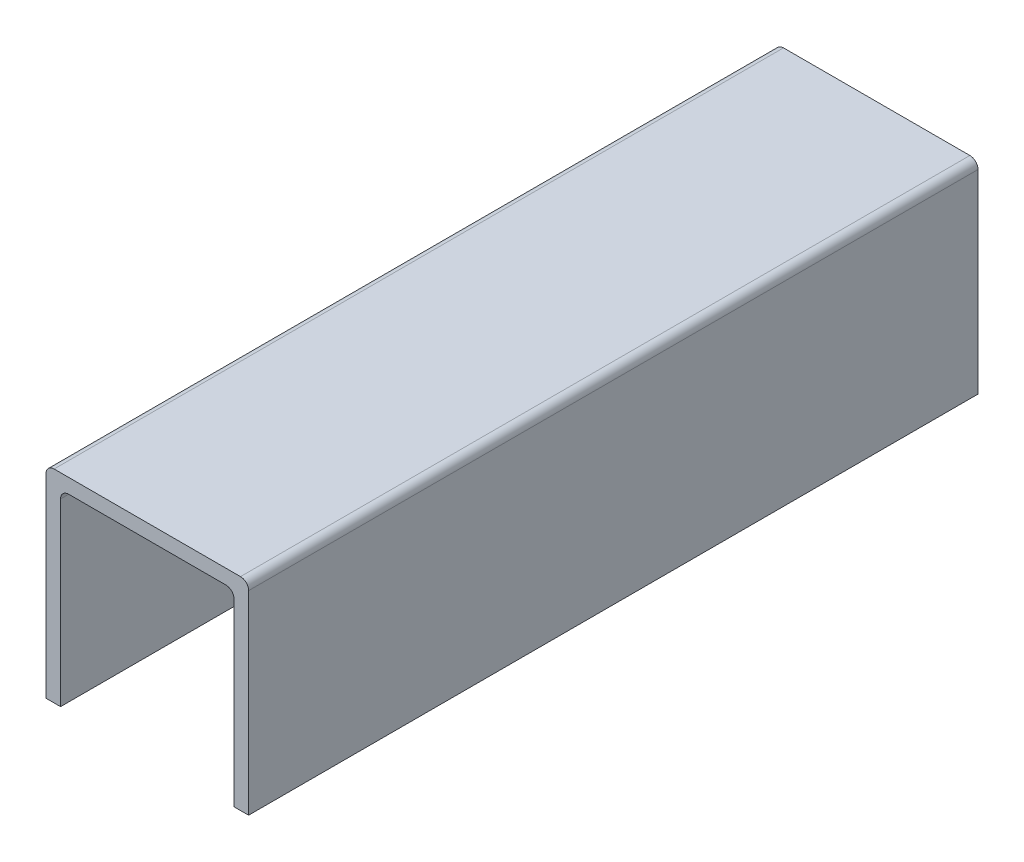
ISO-10303-21;
HEADER;
FILE_DESCRIPTION(('STEP AP214'),'2;1');
FILE_NAME('part.step','',(''),(''),'','','');
FILE_SCHEMA(('AUTOMOTIVE_DESIGN { 1 0 10303 214 1 1 1 1 }'));
ENDSEC;
DATA;
#1=APPLICATION_CONTEXT('core data for automotive mechanical design processes');
#2=APPLICATION_PROTOCOL_DEFINITION('international standard','automotive_design',2000,#1);
#3=PRODUCT_CONTEXT('',#1,'mechanical');
#4=PRODUCT('Part','Part','',(#3));
#5=PRODUCT_RELATED_PRODUCT_CATEGORY('part','',(#4));
#6=PRODUCT_DEFINITION_FORMATION('','',#4);
#7=PRODUCT_DEFINITION_CONTEXT('part definition',#1,'design');
#8=PRODUCT_DEFINITION('design','',#6,#7);
#9=PRODUCT_DEFINITION_SHAPE('','',#8);
#10=(LENGTH_UNIT() NAMED_UNIT(*) SI_UNIT(.MILLI.,.METRE.));
#11=(NAMED_UNIT(*) PLANE_ANGLE_UNIT() SI_UNIT($,.RADIAN.));
#12=(NAMED_UNIT(*) SI_UNIT($,.STERADIAN.) SOLID_ANGLE_UNIT());
#13=UNCERTAINTY_MEASURE_WITH_UNIT(LENGTH_MEASURE(1.E-05),#10,'distance_accuracy_value','');
#14=(GEOMETRIC_REPRESENTATION_CONTEXT(3) GLOBAL_UNCERTAINTY_ASSIGNED_CONTEXT((#13)) GLOBAL_UNIT_ASSIGNED_CONTEXT((#10,
#11,#12)) REPRESENTATION_CONTEXT('',''));
#15=CARTESIAN_POINT('',(0.,0.,0.));
#16=DIRECTION('',(0.,0.,1.));
#17=DIRECTION('',(1.,0.,0.));
#18=AXIS2_PLACEMENT_3D('',#15,#16,#17);
#19=CARTESIAN_POINT('',(3.595,0.,180.));
#20=DIRECTION('',(0.,1.,0.));
#21=DIRECTION('',(-1.,0.,0.));
#22=AXIS2_PLACEMENT_3D('',#19,#20,#21);
#23=PLANE('',#22);
#24=DIRECTION('',(1.,0.,0.));
#25=VECTOR('',#24,1.);
#26=CARTESIAN_POINT('',(3.595,0.,0.));
#27=LINE('',#26,#25);
#28=CARTESIAN_POINT('',(0.,0.,0.));
#29=VERTEX_POINT('',#28);
#30=CARTESIAN_POINT('',(3.595,0.,0.));
#31=VERTEX_POINT('',#30);
#32=EDGE_CURVE('E152',#29,#31,#27,.T.);
#33=ORIENTED_EDGE('',*,*,#32,.T.);
#34=DIRECTION('',(0.,0.,-1.));
#35=VECTOR('',#34,1.);
#36=CARTESIAN_POINT('',(3.595,0.,180.));
#37=LINE('',#36,#35);
#38=CARTESIAN_POINT('',(3.595,0.,180.));
#39=VERTEX_POINT('',#38);
#40=EDGE_CURVE('E133',#39,#31,#37,.T.);
#41=ORIENTED_EDGE('',*,*,#40,.F.);
#42=DIRECTION('',(1.,0.,0.));
#43=VECTOR('',#42,1.);
#44=CARTESIAN_POINT('',(3.595,0.,180.));
#45=LINE('',#44,#43);
#46=CARTESIAN_POINT('',(0.,0.,180.));
#47=VERTEX_POINT('',#46);
#48=EDGE_CURVE('E139',#47,#39,#45,.T.);
#49=ORIENTED_EDGE('',*,*,#48,.F.);
#50=DIRECTION('',(0.,0.,-1.));
#51=VECTOR('',#50,1.);
#52=CARTESIAN_POINT('',(0.,0.,180.));
#53=LINE('',#52,#51);
#54=EDGE_CURVE('E222',#47,#29,#53,.T.);
#55=ORIENTED_EDGE('',*,*,#54,.T.);
#56=EDGE_LOOP('',(#33,#41,#49,#55));
#57=FACE_BOUND('',#56,.T.);
#58=ADVANCED_FACE('F38',(#57),#23,.F.);
#59=CARTESIAN_POINT('',(3.59499999999999,46.405,180.));
#60=DIRECTION('',(-1.,0.,0.));
#61=DIRECTION('',(0.,-1.,0.));
#62=AXIS2_PLACEMENT_3D('',#59,#60,#61);
#63=PLANE('',#62);
#64=DIRECTION('',(0.,1.,0.));
#65=VECTOR('',#64,1.);
#66=CARTESIAN_POINT('',(3.59499999999999,46.405,0.));
#67=LINE('',#66,#65);
#68=CARTESIAN_POINT('',(3.59499999999999,44.405,0.));
#69=VERTEX_POINT('',#68);
#70=EDGE_CURVE('E205',#31,#69,#67,.T.);
#71=ORIENTED_EDGE('',*,*,#70,.T.);
#72=DIRECTION('',(0.,0.,-1.));
#73=VECTOR('',#72,1.);
#74=CARTESIAN_POINT('',(3.595,44.405,180.));
#75=LINE('',#74,#73);
#76=CARTESIAN_POINT('',(3.59499999999999,44.405,180.));
#77=VERTEX_POINT('',#76);
#78=EDGE_CURVE('E136',#69,#77,#75,.F.);
#79=ORIENTED_EDGE('',*,*,#78,.T.);
#80=DIRECTION('',(0.,1.,0.));
#81=VECTOR('',#80,1.);
#82=CARTESIAN_POINT('',(3.59499999999999,46.405,180.));
#83=LINE('',#82,#81);
#84=EDGE_CURVE('E128',#39,#77,#83,.T.);
#85=ORIENTED_EDGE('',*,*,#84,.F.);
#86=ORIENTED_EDGE('',*,*,#40,.T.);
#87=EDGE_LOOP('',(#71,#79,#85,#86));
#88=FACE_BOUND('',#87,.T.);
#89=ADVANCED_FACE('F131',(#88),#63,.F.);
#90=CARTESIAN_POINT('',(46.405,46.405,180.));
#91=DIRECTION('',(0.,1.,0.));
#92=DIRECTION('',(-1.,0.,0.));
#93=AXIS2_PLACEMENT_3D('',#90,#91,#92);
#94=PLANE('',#93);
#95=DIRECTION('',(1.,0.,0.));
#96=VECTOR('',#95,1.);
#97=CARTESIAN_POINT('',(46.405,46.405,180.));
#98=LINE('',#97,#96);
#99=CARTESIAN_POINT('',(5.595,46.405,180.));
#100=VERTEX_POINT('',#99);
#101=CARTESIAN_POINT('',(44.405,46.405,180.));
#102=VERTEX_POINT('',#101);
#103=EDGE_CURVE('E138',#100,#102,#98,.T.);
#104=ORIENTED_EDGE('',*,*,#103,.F.);
#105=DIRECTION('',(0.,0.,-1.));
#106=VECTOR('',#105,1.);
#107=CARTESIAN_POINT('',(5.595,46.405,0.));
#108=LINE('',#107,#106);
#109=CARTESIAN_POINT('',(5.595,46.405,0.));
#110=VERTEX_POINT('',#109);
#111=EDGE_CURVE('E179',#100,#110,#108,.T.);
#112=ORIENTED_EDGE('',*,*,#111,.T.);
#113=DIRECTION('',(1.,0.,0.));
#114=VECTOR('',#113,1.);
#115=CARTESIAN_POINT('',(46.405,46.405,0.));
#116=LINE('',#115,#114);
#117=CARTESIAN_POINT('',(44.405,46.405,0.));
#118=VERTEX_POINT('',#117);
#119=EDGE_CURVE('E195',#110,#118,#116,.T.);
#120=ORIENTED_EDGE('',*,*,#119,.T.);
#121=DIRECTION('',(0.,0.,-1.));
#122=VECTOR('',#121,1.);
#123=CARTESIAN_POINT('',(44.405,46.405,180.));
#124=LINE('',#123,#122);
#125=EDGE_CURVE('E177',#118,#102,#124,.F.);
#126=ORIENTED_EDGE('',*,*,#125,.T.);
#127=EDGE_LOOP('',(#104,#112,#120,#126));
#128=FACE_BOUND('',#127,.T.);
#129=ADVANCED_FACE('F203',(#128),#94,.F.);
#130=CARTESIAN_POINT('',(46.405,0.,180.));
#131=DIRECTION('',(1.,0.,0.));
#132=DIRECTION('',(0.,0.,-1.));
#133=AXIS2_PLACEMENT_3D('',#130,#131,#132);
#134=PLANE('',#133);
#135=DIRECTION('',(0.,-1.,0.));
#136=VECTOR('',#135,1.);
#137=CARTESIAN_POINT('',(46.405,0.,180.));
#138=LINE('',#137,#136);
#139=CARTESIAN_POINT('',(46.405,44.405,180.));
#140=VERTEX_POINT('',#139);
#141=CARTESIAN_POINT('',(46.405,0.,180.));
#142=VERTEX_POINT('',#141);
#143=EDGE_CURVE('E210',#140,#142,#138,.T.);
#144=ORIENTED_EDGE('',*,*,#143,.F.);
#145=DIRECTION('',(0.,0.,-1.));
#146=VECTOR('',#145,1.);
#147=CARTESIAN_POINT('',(46.405,44.405,0.));
#148=LINE('',#147,#146);
#149=CARTESIAN_POINT('',(46.405,44.405,0.));
#150=VERTEX_POINT('',#149);
#151=EDGE_CURVE('E183',#140,#150,#148,.T.);
#152=ORIENTED_EDGE('',*,*,#151,.T.);
#153=DIRECTION('',(0.,-1.,0.));
#154=VECTOR('',#153,1.);
#155=CARTESIAN_POINT('',(46.405,0.,0.));
#156=LINE('',#155,#154);
#157=CARTESIAN_POINT('',(46.405,0.,0.));
#158=VERTEX_POINT('',#157);
#159=EDGE_CURVE('E197',#150,#158,#156,.T.);
#160=ORIENTED_EDGE('',*,*,#159,.T.);
#161=DIRECTION('',(0.,0.,-1.));
#162=VECTOR('',#161,1.);
#163=CARTESIAN_POINT('',(46.405,0.,180.));
#164=LINE('',#163,#162);
#165=EDGE_CURVE('E154',#142,#158,#164,.T.);
#166=ORIENTED_EDGE('',*,*,#165,.F.);
#167=EDGE_LOOP('',(#144,#152,#160,#166));
#168=FACE_BOUND('',#167,.T.);
#169=ADVANCED_FACE('F208',(#168),#134,.F.);
#170=CARTESIAN_POINT('',(50.,0.,180.));
#171=DIRECTION('',(0.,1.,0.));
#172=DIRECTION('',(-1.,0.,0.));
#173=AXIS2_PLACEMENT_3D('',#170,#171,#172);
#174=PLANE('',#173);
#175=DIRECTION('',(1.,0.,0.));
#176=VECTOR('',#175,1.);
#177=CARTESIAN_POINT('',(50.,0.,0.));
#178=LINE('',#177,#176);
#179=CARTESIAN_POINT('',(50.,0.,0.));
#180=VERTEX_POINT('',#179);
#181=EDGE_CURVE('E226',#158,#180,#178,.T.);
#182=ORIENTED_EDGE('',*,*,#181,.T.);
#183=DIRECTION('',(0.,0.,-1.));
#184=VECTOR('',#183,1.);
#185=CARTESIAN_POINT('',(50.,0.,180.));
#186=LINE('',#185,#184);
#187=CARTESIAN_POINT('',(50.,0.,180.));
#188=VERTEX_POINT('',#187);
#189=EDGE_CURVE('E160',#188,#180,#186,.T.);
#190=ORIENTED_EDGE('',*,*,#189,.F.);
#191=DIRECTION('',(1.,0.,0.));
#192=VECTOR('',#191,1.);
#193=CARTESIAN_POINT('',(50.,0.,180.));
#194=LINE('',#193,#192);
#195=EDGE_CURVE('E212',#142,#188,#194,.T.);
#196=ORIENTED_EDGE('',*,*,#195,.F.);
#197=ORIENTED_EDGE('',*,*,#165,.T.);
#198=EDGE_LOOP('',(#182,#190,#196,#197));
#199=FACE_BOUND('',#198,.T.);
#200=ADVANCED_FACE('F286',(#199),#174,.F.);
#201=CARTESIAN_POINT('',(50.,50.,180.));
#202=DIRECTION('',(-1.,0.,0.));
#203=DIRECTION('',(0.,0.,1.));
#204=AXIS2_PLACEMENT_3D('',#201,#202,#203);
#205=PLANE('',#204);
#206=DIRECTION('',(0.,1.,0.));
#207=VECTOR('',#206,1.);
#208=CARTESIAN_POINT('',(50.,50.,0.));
#209=LINE('',#208,#207);
#210=CARTESIAN_POINT('',(50.,48.,0.));
#211=VERTEX_POINT('',#210);
#212=EDGE_CURVE('E228',#180,#211,#209,.T.);
#213=ORIENTED_EDGE('',*,*,#212,.T.);
#214=DIRECTION('',(0.,0.,-1.));
#215=VECTOR('',#214,1.);
#216=CARTESIAN_POINT('',(50.,48.,180.));
#217=LINE('',#216,#215);
#218=CARTESIAN_POINT('',(50.,48.,180.));
#219=VERTEX_POINT('',#218);
#220=EDGE_CURVE('E53',#211,#219,#217,.F.);
#221=ORIENTED_EDGE('',*,*,#220,.T.);
#222=DIRECTION('',(0.,1.,0.));
#223=VECTOR('',#222,1.);
#224=CARTESIAN_POINT('',(50.,50.,180.));
#225=LINE('',#224,#223);
#226=EDGE_CURVE('E214',#188,#219,#225,.T.);
#227=ORIENTED_EDGE('',*,*,#226,.F.);
#228=ORIENTED_EDGE('',*,*,#189,.T.);
#229=EDGE_LOOP('',(#213,#221,#227,#228));
#230=FACE_BOUND('',#229,.T.);
#231=ADVANCED_FACE('F237',(#230),#205,.F.);
#232=CARTESIAN_POINT('',(0.,50.,180.));
#233=DIRECTION('',(0.,-1.,0.));
#234=DIRECTION('',(0.,0.,-1.));
#235=AXIS2_PLACEMENT_3D('',#232,#233,#234);
#236=PLANE('',#235);
#237=DIRECTION('',(-1.,0.,0.));
#238=VECTOR('',#237,1.);
#239=CARTESIAN_POINT('',(0.,50.,0.));
#240=LINE('',#239,#238);
#241=CARTESIAN_POINT('',(48.,50.,0.));
#242=VERTEX_POINT('',#241);
#243=CARTESIAN_POINT('',(2.,50.,0.));
#244=VERTEX_POINT('',#243);
#245=EDGE_CURVE('E230',#242,#244,#240,.T.);
#246=ORIENTED_EDGE('',*,*,#245,.T.);
#247=DIRECTION('',(0.,0.,-1.));
#248=VECTOR('',#247,1.);
#249=CARTESIAN_POINT('',(2.,50.,180.));
#250=LINE('',#249,#248);
#251=CARTESIAN_POINT('',(2.,50.,180.));
#252=VERTEX_POINT('',#251);
#253=EDGE_CURVE('E170',#244,#252,#250,.F.);
#254=ORIENTED_EDGE('',*,*,#253,.T.);
#255=DIRECTION('',(-1.,0.,0.));
#256=VECTOR('',#255,1.);
#257=CARTESIAN_POINT('',(0.,50.,180.));
#258=LINE('',#257,#256);
#259=CARTESIAN_POINT('',(48.,50.,180.));
#260=VERTEX_POINT('',#259);
#261=EDGE_CURVE('E219',#260,#252,#258,.T.);
#262=ORIENTED_EDGE('',*,*,#261,.F.);
#263=DIRECTION('',(0.,0.,-1.));
#264=VECTOR('',#263,1.);
#265=CARTESIAN_POINT('',(48.,50.,180.));
#266=LINE('',#265,#264);
#267=EDGE_CURVE('E167',#260,#242,#266,.T.);
#268=ORIENTED_EDGE('',*,*,#267,.T.);
#269=EDGE_LOOP('',(#246,#254,#262,#268));
#270=FACE_BOUND('',#269,.T.);
#271=ADVANCED_FACE('F246',(#270),#236,.F.);
#272=CARTESIAN_POINT('',(0.,0.,180.));
#273=DIRECTION('',(1.,0.,0.));
#274=DIRECTION('',(0.,0.,-1.));
#275=AXIS2_PLACEMENT_3D('',#272,#273,#274);
#276=PLANE('',#275);
#277=DIRECTION('',(0.,-1.,0.));
#278=VECTOR('',#277,1.);
#279=CARTESIAN_POINT('',(0.,0.,180.));
#280=LINE('',#279,#278);
#281=CARTESIAN_POINT('',(0.,48.,180.));
#282=VERTEX_POINT('',#281);
#283=EDGE_CURVE('E145',#282,#47,#280,.T.);
#284=ORIENTED_EDGE('',*,*,#283,.F.);
#285=DIRECTION('',(0.,0.,-1.));
#286=VECTOR('',#285,1.);
#287=CARTESIAN_POINT('',(0.,48.,180.));
#288=LINE('',#287,#286);
#289=CARTESIAN_POINT('',(0.,48.,0.));
#290=VERTEX_POINT('',#289);
#291=EDGE_CURVE('E153',#282,#290,#288,.T.);
#292=ORIENTED_EDGE('',*,*,#291,.T.);
#293=DIRECTION('',(0.,-1.,0.));
#294=VECTOR('',#293,1.);
#295=CARTESIAN_POINT('',(0.,0.,0.));
#296=LINE('',#295,#294);
#297=EDGE_CURVE('E149',#290,#29,#296,.T.);
#298=ORIENTED_EDGE('',*,*,#297,.T.);
#299=ORIENTED_EDGE('',*,*,#54,.F.);
#300=EDGE_LOOP('',(#284,#292,#298,#299));
#301=FACE_BOUND('',#300,.T.);
#302=ADVANCED_FACE('F253',(#301),#276,.F.);
#303=CARTESIAN_POINT('',(0.,0.,180.));
#304=DIRECTION('',(0.,0.,-1.));
#305=DIRECTION('',(-1.,0.,0.));
#306=AXIS2_PLACEMENT_3D('',#303,#304,#305);
#307=PLANE('',#306);
#308=ORIENTED_EDGE('',*,*,#261,.T.);
#309=CARTESIAN_POINT('',(2.,48.,180.));
#310=DIRECTION('',(0.,0.,-1.));
#311=DIRECTION('',(-1.,0.,0.));
#312=AXIS2_PLACEMENT_3D('',#309,#310,#311);
#313=CIRCLE('',#312,2.);
#314=EDGE_CURVE('E174',#252,#282,#313,.F.);
#315=ORIENTED_EDGE('',*,*,#314,.T.);
#316=ORIENTED_EDGE('',*,*,#283,.T.);
#317=ORIENTED_EDGE('',*,*,#48,.T.);
#318=ORIENTED_EDGE('',*,*,#84,.T.);
#319=CARTESIAN_POINT('',(5.595,44.405,180.));
#320=DIRECTION('',(0.,0.,-1.));
#321=DIRECTION('',(-1.,0.,0.));
#322=AXIS2_PLACEMENT_3D('',#319,#320,#321);
#323=CIRCLE('',#322,2.);
#324=EDGE_CURVE('E188',#77,#100,#323,.T.);
#325=ORIENTED_EDGE('',*,*,#324,.T.);
#326=ORIENTED_EDGE('',*,*,#103,.T.);
#327=CARTESIAN_POINT('',(44.405,44.405,180.));
#328=DIRECTION('',(0.,0.,-1.));
#329=DIRECTION('',(-1.,0.,0.));
#330=AXIS2_PLACEMENT_3D('',#327,#328,#329);
#331=CIRCLE('',#330,2.);
#332=EDGE_CURVE('E11',#102,#140,#331,.T.);
#333=ORIENTED_EDGE('',*,*,#332,.T.);
#334=ORIENTED_EDGE('',*,*,#143,.T.);
#335=ORIENTED_EDGE('',*,*,#195,.T.);
#336=ORIENTED_EDGE('',*,*,#226,.T.);
#337=CARTESIAN_POINT('',(48.,48.,180.));
#338=DIRECTION('',(0.,0.,-1.));
#339=DIRECTION('',(-1.,0.,0.));
#340=AXIS2_PLACEMENT_3D('',#337,#338,#339);
#341=CIRCLE('',#340,2.);
#342=EDGE_CURVE('E172',#219,#260,#341,.F.);
#343=ORIENTED_EDGE('',*,*,#342,.T.);
#344=EDGE_LOOP('',(#308,#315,#316,#317,#318,#325,#326,#333,#334,#335,#336,#343));
#345=FACE_BOUND('',#344,.T.);
#346=ADVANCED_FACE('F143',(#345),#307,.F.);
#347=CARTESIAN_POINT('',(0.,0.,0.));
#348=DIRECTION('',(0.,0.,-1.));
#349=DIRECTION('',(-1.,0.,0.));
#350=AXIS2_PLACEMENT_3D('',#347,#348,#349);
#351=PLANE('',#350);
#352=ORIENTED_EDGE('',*,*,#297,.F.);
#353=CARTESIAN_POINT('',(2.,48.,0.));
#354=DIRECTION('',(0.,0.,-1.));
#355=DIRECTION('',(-1.,0.,0.));
#356=AXIS2_PLACEMENT_3D('',#353,#354,#355);
#357=CIRCLE('',#356,2.);
#358=EDGE_CURVE('E165',#290,#244,#357,.T.);
#359=ORIENTED_EDGE('',*,*,#358,.T.);
#360=ORIENTED_EDGE('',*,*,#245,.F.);
#361=CARTESIAN_POINT('',(48.,48.,0.));
#362=DIRECTION('',(0.,0.,-1.));
#363=DIRECTION('',(-1.,0.,0.));
#364=AXIS2_PLACEMENT_3D('',#361,#362,#363);
#365=CIRCLE('',#364,2.);
#366=EDGE_CURVE('E157',#242,#211,#365,.T.);
#367=ORIENTED_EDGE('',*,*,#366,.T.);
#368=ORIENTED_EDGE('',*,*,#212,.F.);
#369=ORIENTED_EDGE('',*,*,#181,.F.);
#370=ORIENTED_EDGE('',*,*,#159,.F.);
#371=CARTESIAN_POINT('',(44.405,44.405,0.));
#372=DIRECTION('',(0.,0.,-1.));
#373=DIRECTION('',(-1.,0.,0.));
#374=AXIS2_PLACEMENT_3D('',#371,#372,#373);
#375=CIRCLE('',#374,2.);
#376=EDGE_CURVE('E46',#150,#118,#375,.F.);
#377=ORIENTED_EDGE('',*,*,#376,.T.);
#378=ORIENTED_EDGE('',*,*,#119,.F.);
#379=CARTESIAN_POINT('',(5.595,44.405,0.));
#380=DIRECTION('',(0.,0.,-1.));
#381=DIRECTION('',(-1.,0.,0.));
#382=AXIS2_PLACEMENT_3D('',#379,#380,#381);
#383=CIRCLE('',#382,2.);
#384=EDGE_CURVE('E186',#110,#69,#383,.F.);
#385=ORIENTED_EDGE('',*,*,#384,.T.);
#386=ORIENTED_EDGE('',*,*,#70,.F.);
#387=ORIENTED_EDGE('',*,*,#32,.F.);
#388=EDGE_LOOP('',(#352,#359,#360,#367,#368,#369,#370,#377,#378,#385,#386,#387));
#389=FACE_BOUND('',#388,.T.);
#390=ADVANCED_FACE('F194',(#389),#351,.T.);
#391=CARTESIAN_POINT('',(2.,48.,180.));
#392=DIRECTION('',(0.,0.,-1.));
#393=DIRECTION('',(-1.,0.,0.));
#394=AXIS2_PLACEMENT_3D('',#391,#392,#393);
#395=CYLINDRICAL_SURFACE('',#394,2.);
#396=ORIENTED_EDGE('',*,*,#314,.F.);
#397=ORIENTED_EDGE('',*,*,#253,.F.);
#398=ORIENTED_EDGE('',*,*,#358,.F.);
#399=ORIENTED_EDGE('',*,*,#291,.F.);
#400=EDGE_LOOP('',(#396,#397,#398,#399));
#401=FACE_BOUND('',#400,.T.);
#402=ADVANCED_FACE('F251',(#401),#395,.T.);
#403=CARTESIAN_POINT('',(48.,48.,180.));
#404=DIRECTION('',(0.,0.,-1.));
#405=DIRECTION('',(-1.,0.,0.));
#406=AXIS2_PLACEMENT_3D('',#403,#404,#405);
#407=CYLINDRICAL_SURFACE('',#406,2.);
#408=ORIENTED_EDGE('',*,*,#342,.F.);
#409=ORIENTED_EDGE('',*,*,#220,.F.);
#410=ORIENTED_EDGE('',*,*,#366,.F.);
#411=ORIENTED_EDGE('',*,*,#267,.F.);
#412=EDGE_LOOP('',(#408,#409,#410,#411));
#413=FACE_BOUND('',#412,.T.);
#414=ADVANCED_FACE('F243',(#413),#407,.T.);
#415=CARTESIAN_POINT('',(5.595,44.405,180.));
#416=DIRECTION('',(0.,0.,1.));
#417=DIRECTION('',(1.,0.,0.));
#418=AXIS2_PLACEMENT_3D('',#415,#416,#417);
#419=CYLINDRICAL_SURFACE('',#418,2.);
#420=ORIENTED_EDGE('',*,*,#324,.F.);
#421=ORIENTED_EDGE('',*,*,#78,.F.);
#422=ORIENTED_EDGE('',*,*,#384,.F.);
#423=ORIENTED_EDGE('',*,*,#111,.F.);
#424=EDGE_LOOP('',(#420,#421,#422,#423));
#425=FACE_BOUND('',#424,.T.);
#426=ADVANCED_FACE('F255',(#425),#419,.F.);
#427=CARTESIAN_POINT('',(44.405,44.405,180.));
#428=DIRECTION('',(0.,0.,1.));
#429=DIRECTION('',(1.,0.,0.));
#430=AXIS2_PLACEMENT_3D('',#427,#428,#429);
#431=CYLINDRICAL_SURFACE('',#430,2.);
#432=ORIENTED_EDGE('',*,*,#332,.F.);
#433=ORIENTED_EDGE('',*,*,#125,.F.);
#434=ORIENTED_EDGE('',*,*,#376,.F.);
#435=ORIENTED_EDGE('',*,*,#151,.F.);
#436=EDGE_LOOP('',(#432,#433,#434,#435));
#437=FACE_BOUND('',#436,.T.);
#438=ADVANCED_FACE('F40',(#437),#431,.F.);
#439=CLOSED_SHELL('',(#58,#89,#129,#169,#200,#231,#271,#302,#346,#390,#402,#414,#426,#438));
#440=MANIFOLD_SOLID_BREP('B2',#439);
#441=ADVANCED_BREP_SHAPE_REPRESENTATION('',(#18,#440),#14);
#442=SHAPE_DEFINITION_REPRESENTATION(#9,#441);
ENDSEC;
END-ISO-10303-21;
